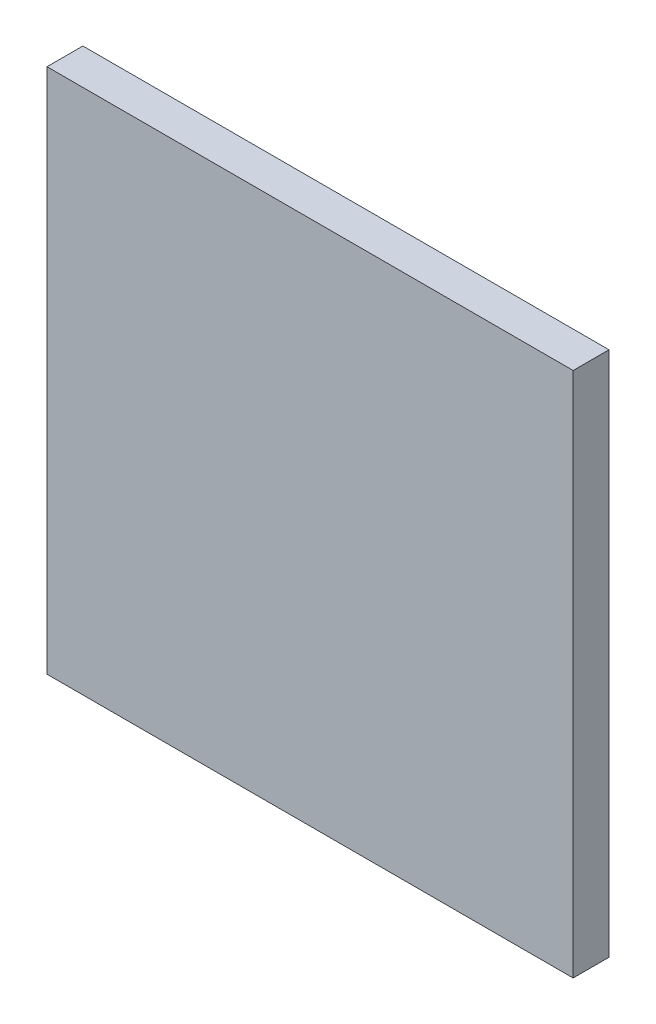
ISO-10303-21;
HEADER;
FILE_DESCRIPTION(('STEP AP214'),'2;1');
FILE_NAME('part.step','',(''),(''),'','','');
FILE_SCHEMA(('AUTOMOTIVE_DESIGN { 1 0 10303 214 1 1 1 1 }'));
ENDSEC;
DATA;
#1=APPLICATION_CONTEXT('core data for automotive mechanical design processes');
#2=APPLICATION_PROTOCOL_DEFINITION('international standard','automotive_design',2000,#1);
#3=PRODUCT_CONTEXT('',#1,'mechanical');
#4=PRODUCT('Part','Part','',(#3));
#5=PRODUCT_RELATED_PRODUCT_CATEGORY('part','',(#4));
#6=PRODUCT_DEFINITION_FORMATION('','',#4);
#7=PRODUCT_DEFINITION_CONTEXT('part definition',#1,'design');
#8=PRODUCT_DEFINITION('design','',#6,#7);
#9=PRODUCT_DEFINITION_SHAPE('','',#8);
#10=(LENGTH_UNIT() NAMED_UNIT(*) SI_UNIT(.MILLI.,.METRE.));
#11=(NAMED_UNIT(*) PLANE_ANGLE_UNIT() SI_UNIT($,.RADIAN.));
#12=(NAMED_UNIT(*) SI_UNIT($,.STERADIAN.) SOLID_ANGLE_UNIT());
#13=UNCERTAINTY_MEASURE_WITH_UNIT(LENGTH_MEASURE(1.E-05),#10,'distance_accuracy_value','');
#14=(GEOMETRIC_REPRESENTATION_CONTEXT(3) GLOBAL_UNCERTAINTY_ASSIGNED_CONTEXT((#13)) GLOBAL_UNIT_ASSIGNED_CONTEXT((#10,
#11,#12)) REPRESENTATION_CONTEXT('',''));
#15=CARTESIAN_POINT('',(0.,0.,0.));
#16=DIRECTION('',(0.,0.,1.));
#17=DIRECTION('',(1.,0.,0.));
#18=AXIS2_PLACEMENT_3D('',#15,#16,#17);
#19=CARTESIAN_POINT('',(11.,-11.,1.5));
#20=DIRECTION('',(-1.,0.,0.));
#21=DIRECTION('',(0.,0.,1.));
#22=AXIS2_PLACEMENT_3D('',#19,#20,#21);
#23=PLANE('',#22);
#24=DIRECTION('',(0.,1.,0.));
#25=VECTOR('',#24,1.);
#26=CARTESIAN_POINT('',(11.,-11.,0.));
#27=LINE('',#26,#25);
#28=CARTESIAN_POINT('',(11.,-11.,0.));
#29=VERTEX_POINT('',#28);
#30=CARTESIAN_POINT('',(11.,11.,0.));
#31=VERTEX_POINT('',#30);
#32=EDGE_CURVE('E96',#29,#31,#27,.T.);
#33=ORIENTED_EDGE('',*,*,#32,.T.);
#34=DIRECTION('',(0.,0.,-1.));
#35=VECTOR('',#34,1.);
#36=CARTESIAN_POINT('',(11.,11.,1.5));
#37=LINE('',#36,#35);
#38=CARTESIAN_POINT('',(11.,11.,1.5));
#39=VERTEX_POINT('',#38);
#40=EDGE_CURVE('E11',#39,#31,#37,.T.);
#41=ORIENTED_EDGE('',*,*,#40,.F.);
#42=DIRECTION('',(0.,1.,0.));
#43=VECTOR('',#42,1.);
#44=CARTESIAN_POINT('',(11.,-11.,1.5));
#45=LINE('',#44,#43);
#46=CARTESIAN_POINT('',(11.,-11.,1.5));
#47=VERTEX_POINT('',#46);
#48=EDGE_CURVE('E84',#47,#39,#45,.T.);
#49=ORIENTED_EDGE('',*,*,#48,.F.);
#50=DIRECTION('',(0.,0.,-1.));
#51=VECTOR('',#50,1.);
#52=CARTESIAN_POINT('',(11.,-11.,1.5));
#53=LINE('',#52,#51);
#54=EDGE_CURVE('E92',#47,#29,#53,.T.);
#55=ORIENTED_EDGE('',*,*,#54,.T.);
#56=EDGE_LOOP('',(#33,#41,#49,#55));
#57=FACE_BOUND('',#56,.T.);
#58=ADVANCED_FACE('F33',(#57),#23,.F.);
#59=CARTESIAN_POINT('',(-11.,11.,1.5));
#60=DIRECTION('',(0.,-1.,0.));
#61=DIRECTION('',(0.,0.,-1.));
#62=AXIS2_PLACEMENT_3D('',#59,#60,#61);
#63=PLANE('',#62);
#64=DIRECTION('',(-1.,0.,0.));
#65=VECTOR('',#64,1.);
#66=CARTESIAN_POINT('',(-11.,11.,0.));
#67=LINE('',#66,#65);
#68=CARTESIAN_POINT('',(-11.,11.,0.));
#69=VERTEX_POINT('',#68);
#70=EDGE_CURVE('E88',#31,#69,#67,.T.);
#71=ORIENTED_EDGE('',*,*,#70,.T.);
#72=DIRECTION('',(0.,0.,-1.));
#73=VECTOR('',#72,1.);
#74=CARTESIAN_POINT('',(-11.,11.,1.5));
#75=LINE('',#74,#73);
#76=CARTESIAN_POINT('',(-11.,11.,1.5));
#77=VERTEX_POINT('',#76);
#78=EDGE_CURVE('E41',#77,#69,#75,.T.);
#79=ORIENTED_EDGE('',*,*,#78,.F.);
#80=DIRECTION('',(-1.,0.,0.));
#81=VECTOR('',#80,1.);
#82=CARTESIAN_POINT('',(-11.,11.,1.5));
#83=LINE('',#82,#81);
#84=EDGE_CURVE('E79',#39,#77,#83,.T.);
#85=ORIENTED_EDGE('',*,*,#84,.F.);
#86=ORIENTED_EDGE('',*,*,#40,.T.);
#87=EDGE_LOOP('',(#71,#79,#85,#86));
#88=FACE_BOUND('',#87,.T.);
#89=ADVANCED_FACE('F87',(#88),#63,.F.);
#90=CARTESIAN_POINT('',(-11.,-11.,1.5));
#91=DIRECTION('',(1.,0.,0.));
#92=DIRECTION('',(0.,0.,-1.));
#93=AXIS2_PLACEMENT_3D('',#90,#91,#92);
#94=PLANE('',#93);
#95=DIRECTION('',(0.,-1.,0.));
#96=VECTOR('',#95,1.);
#97=CARTESIAN_POINT('',(-11.,-11.,0.));
#98=LINE('',#97,#96);
#99=CARTESIAN_POINT('',(-11.,-11.,0.));
#100=VERTEX_POINT('',#99);
#101=EDGE_CURVE('E66',#69,#100,#98,.T.);
#102=ORIENTED_EDGE('',*,*,#101,.T.);
#103=DIRECTION('',(0.,0.,-1.));
#104=VECTOR('',#103,1.);
#105=CARTESIAN_POINT('',(-11.,-11.,1.5));
#106=LINE('',#105,#104);
#107=CARTESIAN_POINT('',(-11.,-11.,1.5));
#108=VERTEX_POINT('',#107);
#109=EDGE_CURVE('E89',#108,#100,#106,.T.);
#110=ORIENTED_EDGE('',*,*,#109,.F.);
#111=DIRECTION('',(0.,-1.,0.));
#112=VECTOR('',#111,1.);
#113=CARTESIAN_POINT('',(-11.,-11.,1.5));
#114=LINE('',#113,#112);
#115=EDGE_CURVE('E82',#77,#108,#114,.T.);
#116=ORIENTED_EDGE('',*,*,#115,.F.);
#117=ORIENTED_EDGE('',*,*,#78,.T.);
#118=EDGE_LOOP('',(#102,#110,#116,#117));
#119=FACE_BOUND('',#118,.T.);
#120=ADVANCED_FACE('F90',(#119),#94,.F.);
#121=CARTESIAN_POINT('',(-11.,-11.,1.5));
#122=DIRECTION('',(0.,1.,0.));
#123=DIRECTION('',(-1.,0.,0.));
#124=AXIS2_PLACEMENT_3D('',#121,#122,#123);
#125=PLANE('',#124);
#126=DIRECTION('',(1.,0.,0.));
#127=VECTOR('',#126,1.);
#128=CARTESIAN_POINT('',(-11.,-11.,0.));
#129=LINE('',#128,#127);
#130=EDGE_CURVE('E72',#100,#29,#129,.T.);
#131=ORIENTED_EDGE('',*,*,#130,.T.);
#132=ORIENTED_EDGE('',*,*,#54,.F.);
#133=DIRECTION('',(1.,0.,0.));
#134=VECTOR('',#133,1.);
#135=CARTESIAN_POINT('',(-11.,-11.,1.5));
#136=LINE('',#135,#134);
#137=EDGE_CURVE('E49',#108,#47,#136,.T.);
#138=ORIENTED_EDGE('',*,*,#137,.F.);
#139=ORIENTED_EDGE('',*,*,#109,.T.);
#140=EDGE_LOOP('',(#131,#132,#138,#139));
#141=FACE_BOUND('',#140,.T.);
#142=ADVANCED_FACE('F103',(#141),#125,.F.);
#143=CARTESIAN_POINT('',(0.,0.,1.5));
#144=DIRECTION('',(0.,0.,-1.));
#145=DIRECTION('',(-1.,0.,0.));
#146=AXIS2_PLACEMENT_3D('',#143,#144,#145);
#147=PLANE('',#146);
#148=ORIENTED_EDGE('',*,*,#48,.T.);
#149=ORIENTED_EDGE('',*,*,#84,.T.);
#150=ORIENTED_EDGE('',*,*,#115,.T.);
#151=ORIENTED_EDGE('',*,*,#137,.T.);
#152=EDGE_LOOP('',(#148,#149,#150,#151));
#153=FACE_BOUND('',#152,.T.);
#154=ADVANCED_FACE('F80',(#153),#147,.F.);
#155=CARTESIAN_POINT('',(0.,0.,0.));
#156=DIRECTION('',(0.,0.,-1.));
#157=DIRECTION('',(-1.,0.,0.));
#158=AXIS2_PLACEMENT_3D('',#155,#156,#157);
#159=PLANE('',#158);
#160=ORIENTED_EDGE('',*,*,#32,.F.);
#161=ORIENTED_EDGE('',*,*,#130,.F.);
#162=ORIENTED_EDGE('',*,*,#101,.F.);
#163=ORIENTED_EDGE('',*,*,#70,.F.);
#164=EDGE_LOOP('',(#160,#161,#162,#163));
#165=FACE_BOUND('',#164,.T.);
#166=ADVANCED_FACE('F106',(#165),#159,.T.);
#167=CLOSED_SHELL('',(#58,#89,#120,#142,#154,#166));
#168=MANIFOLD_SOLID_BREP('B2',#167);
#169=ADVANCED_BREP_SHAPE_REPRESENTATION('',(#18,#168),#14);
#170=SHAPE_DEFINITION_REPRESENTATION(#9,#169);
ENDSEC;
END-ISO-10303-21;
